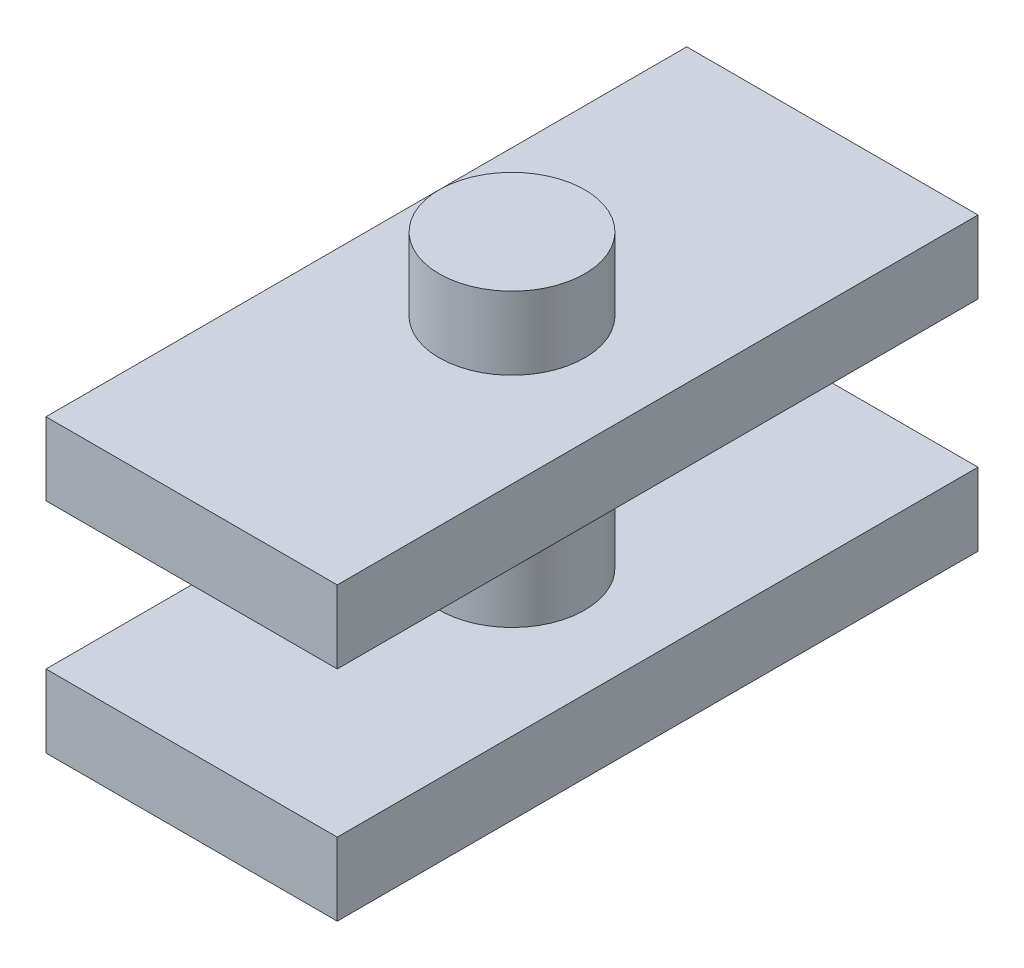
ISO-10303-21;
HEADER;
FILE_DESCRIPTION(('STEP AP214'),'2;1');
FILE_NAME('part.step','',(''),(''),'','','');
FILE_SCHEMA(('AUTOMOTIVE_DESIGN { 1 0 10303 214 1 1 1 1 }'));
ENDSEC;
DATA;
#1=APPLICATION_CONTEXT('core data for automotive mechanical design processes');
#2=APPLICATION_PROTOCOL_DEFINITION('international standard','automotive_design',2000,#1);
#3=PRODUCT_CONTEXT('',#1,'mechanical');
#4=PRODUCT('Part','Part','',(#3));
#5=PRODUCT_RELATED_PRODUCT_CATEGORY('part','',(#4));
#6=PRODUCT_DEFINITION_FORMATION('','',#4);
#7=PRODUCT_DEFINITION_CONTEXT('part definition',#1,'design');
#8=PRODUCT_DEFINITION('design','',#6,#7);
#9=PRODUCT_DEFINITION_SHAPE('','',#8);
#10=(LENGTH_UNIT() NAMED_UNIT(*) SI_UNIT(.MILLI.,.METRE.));
#11=(NAMED_UNIT(*) PLANE_ANGLE_UNIT() SI_UNIT($,.RADIAN.));
#12=(NAMED_UNIT(*) SI_UNIT($,.STERADIAN.) SOLID_ANGLE_UNIT());
#13=UNCERTAINTY_MEASURE_WITH_UNIT(LENGTH_MEASURE(1.E-05),#10,'distance_accuracy_value','');
#14=(GEOMETRIC_REPRESENTATION_CONTEXT(3) GLOBAL_UNCERTAINTY_ASSIGNED_CONTEXT((#13)) GLOBAL_UNIT_ASSIGNED_CONTEXT((#10,
#11,#12)) REPRESENTATION_CONTEXT('',''));
#15=CARTESIAN_POINT('',(0.,0.,0.));
#16=DIRECTION('',(0.,0.,1.));
#17=DIRECTION('',(1.,0.,0.));
#18=AXIS2_PLACEMENT_3D('',#15,#16,#17);
#19=CARTESIAN_POINT('',(-10.,9.99999999999999,-22.));
#20=DIRECTION('',(1.,0.,0.));
#21=DIRECTION('',(0.,0.,-1.));
#22=AXIS2_PLACEMENT_3D('',#19,#20,#21);
#23=PLANE('',#22);
#24=DIRECTION('',(0.,0.,1.));
#25=VECTOR('',#24,1.);
#26=CARTESIAN_POINT('',(-10.,4.99999999999999,-22.));
#27=LINE('',#26,#25);
#28=CARTESIAN_POINT('',(-10.,4.99999999999999,-22.));
#29=VERTEX_POINT('',#28);
#30=CARTESIAN_POINT('',(-10.,4.99999999999999,22.));
#31=VERTEX_POINT('',#30);
#32=EDGE_CURVE('E55',#29,#31,#27,.T.);
#33=ORIENTED_EDGE('',*,*,#32,.T.);
#34=DIRECTION('',(0.,-1.,0.));
#35=VECTOR('',#34,1.);
#36=CARTESIAN_POINT('',(-10.,9.99999999999999,22.));
#37=LINE('',#36,#35);
#38=CARTESIAN_POINT('',(-10.,9.99999999999999,22.));
#39=VERTEX_POINT('',#38);
#40=EDGE_CURVE('E133',#39,#31,#37,.T.);
#41=ORIENTED_EDGE('',*,*,#40,.F.);
#42=DIRECTION('',(0.,0.,1.));
#43=VECTOR('',#42,1.);
#44=CARTESIAN_POINT('',(-10.,9.99999999999999,-22.));
#45=LINE('',#44,#43);
#46=CARTESIAN_POINT('',(-10.,9.99999999999999,-22.));
#47=VERTEX_POINT('',#46);
#48=EDGE_CURVE('E208',#47,#39,#45,.T.);
#49=ORIENTED_EDGE('',*,*,#48,.F.);
#50=DIRECTION('',(0.,-1.,0.));
#51=VECTOR('',#50,1.);
#52=CARTESIAN_POINT('',(-10.,9.99999999999999,-22.));
#53=LINE('',#52,#51);
#54=EDGE_CURVE('E129',#47,#29,#53,.T.);
#55=ORIENTED_EDGE('',*,*,#54,.T.);
#56=EDGE_LOOP('',(#33,#41,#49,#55));
#57=FACE_BOUND('',#56,.T.);
#58=ADVANCED_FACE('F39',(#57),#23,.F.);
#59=CARTESIAN_POINT('',(-10.,9.99999999999999,22.));
#60=DIRECTION('',(0.,0.,-1.));
#61=DIRECTION('',(-1.,0.,0.));
#62=AXIS2_PLACEMENT_3D('',#59,#60,#61);
#63=PLANE('',#62);
#64=DIRECTION('',(1.,0.,0.));
#65=VECTOR('',#64,1.);
#66=CARTESIAN_POINT('',(-10.,4.99999999999999,22.));
#67=LINE('',#66,#65);
#68=CARTESIAN_POINT('',(10.,4.99999999999999,22.));
#69=VERTEX_POINT('',#68);
#70=EDGE_CURVE('E124',#31,#69,#67,.T.);
#71=ORIENTED_EDGE('',*,*,#70,.T.);
#72=DIRECTION('',(0.,-1.,0.));
#73=VECTOR('',#72,1.);
#74=CARTESIAN_POINT('',(10.,9.99999999999999,22.));
#75=LINE('',#74,#73);
#76=CARTESIAN_POINT('',(10.,9.99999999999999,22.));
#77=VERTEX_POINT('',#76);
#78=EDGE_CURVE('E122',#77,#69,#75,.T.);
#79=ORIENTED_EDGE('',*,*,#78,.F.);
#80=DIRECTION('',(1.,0.,0.));
#81=VECTOR('',#80,1.);
#82=CARTESIAN_POINT('',(-10.,9.99999999999999,22.));
#83=LINE('',#82,#81);
#84=EDGE_CURVE('E135',#39,#77,#83,.T.);
#85=ORIENTED_EDGE('',*,*,#84,.F.);
#86=ORIENTED_EDGE('',*,*,#40,.T.);
#87=EDGE_LOOP('',(#71,#79,#85,#86));
#88=FACE_BOUND('',#87,.T.);
#89=ADVANCED_FACE('F249',(#88),#63,.F.);
#90=CARTESIAN_POINT('',(10.,9.99999999999999,-22.));
#91=DIRECTION('',(-1.,0.,0.));
#92=DIRECTION('',(0.,0.,1.));
#93=AXIS2_PLACEMENT_3D('',#90,#91,#92);
#94=PLANE('',#93);
#95=DIRECTION('',(0.,0.,-1.));
#96=VECTOR('',#95,1.);
#97=CARTESIAN_POINT('',(10.,4.99999999999999,-22.));
#98=LINE('',#97,#96);
#99=CARTESIAN_POINT('',(10.,4.99999999999999,-22.));
#100=VERTEX_POINT('',#99);
#101=EDGE_CURVE('E106',#69,#100,#98,.T.);
#102=ORIENTED_EDGE('',*,*,#101,.T.);
#103=DIRECTION('',(0.,-1.,0.));
#104=VECTOR('',#103,1.);
#105=CARTESIAN_POINT('',(10.,9.99999999999999,-22.));
#106=LINE('',#105,#104);
#107=CARTESIAN_POINT('',(10.,9.99999999999999,-22.));
#108=VERTEX_POINT('',#107);
#109=EDGE_CURVE('E119',#108,#100,#106,.T.);
#110=ORIENTED_EDGE('',*,*,#109,.F.);
#111=DIRECTION('',(0.,0.,-1.));
#112=VECTOR('',#111,1.);
#113=CARTESIAN_POINT('',(10.,9.99999999999999,-22.));
#114=LINE('',#113,#112);
#115=EDGE_CURVE('E219',#77,#108,#114,.T.);
#116=ORIENTED_EDGE('',*,*,#115,.F.);
#117=ORIENTED_EDGE('',*,*,#78,.T.);
#118=EDGE_LOOP('',(#102,#110,#116,#117));
#119=FACE_BOUND('',#118,.T.);
#120=ADVANCED_FACE('F117',(#119),#94,.F.);
#121=CARTESIAN_POINT('',(-10.,9.99999999999999,-22.));
#122=DIRECTION('',(0.,0.,1.));
#123=DIRECTION('',(1.,0.,0.));
#124=AXIS2_PLACEMENT_3D('',#121,#122,#123);
#125=PLANE('',#124);
#126=DIRECTION('',(-1.,0.,0.));
#127=VECTOR('',#126,1.);
#128=CARTESIAN_POINT('',(-10.,4.99999999999999,-22.));
#129=LINE('',#128,#127);
#130=EDGE_CURVE('E102',#100,#29,#129,.T.);
#131=ORIENTED_EDGE('',*,*,#130,.T.);
#132=ORIENTED_EDGE('',*,*,#54,.F.);
#133=DIRECTION('',(-1.,0.,0.));
#134=VECTOR('',#133,1.);
#135=CARTESIAN_POINT('',(-10.,9.99999999999999,-22.));
#136=LINE('',#135,#134);
#137=EDGE_CURVE('E127',#108,#47,#136,.T.);
#138=ORIENTED_EDGE('',*,*,#137,.F.);
#139=ORIENTED_EDGE('',*,*,#109,.T.);
#140=EDGE_LOOP('',(#131,#132,#138,#139));
#141=FACE_BOUND('',#140,.T.);
#142=ADVANCED_FACE('F126',(#141),#125,.F.);
#143=CARTESIAN_POINT('',(0.,30.,0.));
#144=DIRECTION('',(0.,-1.,0.));
#145=DIRECTION('',(0.,0.,-1.));
#146=AXIS2_PLACEMENT_3D('',#143,#144,#145);
#147=CYLINDRICAL_SURFACE('',#146,5.);
#148=CARTESIAN_POINT('',(0.,20.,0.));
#149=DIRECTION('',(0.,1.,0.));
#150=DIRECTION('',(0.,0.,1.));
#151=AXIS2_PLACEMENT_3D('',#148,#149,#150);
#152=CIRCLE('',#151,5.);
#153=CARTESIAN_POINT('',(0.,20.,5.));
#154=VERTEX_POINT('',#153);
#155=EDGE_CURVE('E48',#154,#154,#152,.T.);
#156=ORIENTED_EDGE('',*,*,#155,.F.);
#157=EDGE_LOOP('',(#156));
#158=FACE_BOUND('',#157,.T.);
#159=CARTESIAN_POINT('',(0.,9.99999999999999,0.));
#160=DIRECTION('',(0.,-1.,0.));
#161=DIRECTION('',(0.,0.,-1.));
#162=AXIS2_PLACEMENT_3D('',#159,#160,#161);
#163=CIRCLE('',#162,5.);
#164=CARTESIAN_POINT('',(0.,9.99999999999999,-5.));
#165=VERTEX_POINT('',#164);
#166=EDGE_CURVE('E11',#165,#165,#163,.T.);
#167=ORIENTED_EDGE('',*,*,#166,.F.);
#168=EDGE_LOOP('',(#167));
#169=FACE_BOUND('',#168,.T.);
#170=ADVANCED_FACE('F41',(#158,#169),#147,.T.);
#171=CARTESIAN_POINT('',(-10.,20.,-22.));
#172=DIRECTION('',(-1.,0.,0.));
#173=DIRECTION('',(0.,0.,1.));
#174=AXIS2_PLACEMENT_3D('',#171,#172,#173);
#175=PLANE('',#174);
#176=DIRECTION('',(0.,1.,0.));
#177=VECTOR('',#176,1.);
#178=CARTESIAN_POINT('',(-10.,20.,22.));
#179=LINE('',#178,#177);
#180=CARTESIAN_POINT('',(-10.,20.,22.));
#181=VERTEX_POINT('',#180);
#182=CARTESIAN_POINT('',(-10.,25.,22.));
#183=VERTEX_POINT('',#182);
#184=EDGE_CURVE('E174',#181,#183,#179,.T.);
#185=ORIENTED_EDGE('',*,*,#184,.T.);
#186=DIRECTION('',(0.,0.,1.));
#187=VECTOR('',#186,1.);
#188=CARTESIAN_POINT('',(-10.,25.,-22.));
#189=LINE('',#188,#187);
#190=CARTESIAN_POINT('',(-10.,25.,-22.));
#191=VERTEX_POINT('',#190);
#192=EDGE_CURVE('E63',#191,#183,#189,.T.);
#193=ORIENTED_EDGE('',*,*,#192,.F.);
#194=DIRECTION('',(0.,1.,0.));
#195=VECTOR('',#194,1.);
#196=CARTESIAN_POINT('',(-10.,20.,-22.));
#197=LINE('',#196,#195);
#198=CARTESIAN_POINT('',(-10.,20.,-22.));
#199=VERTEX_POINT('',#198);
#200=EDGE_CURVE('E175',#199,#191,#197,.T.);
#201=ORIENTED_EDGE('',*,*,#200,.F.);
#202=DIRECTION('',(0.,0.,1.));
#203=VECTOR('',#202,1.);
#204=CARTESIAN_POINT('',(-10.,20.,-22.));
#205=LINE('',#204,#203);
#206=EDGE_CURVE('E158',#199,#181,#205,.T.);
#207=ORIENTED_EDGE('',*,*,#206,.T.);
#208=EDGE_LOOP('',(#185,#193,#201,#207));
#209=FACE_BOUND('',#208,.T.);
#210=ADVANCED_FACE('F198',(#209),#175,.T.);
#211=CARTESIAN_POINT('',(-10.,20.,-22.));
#212=DIRECTION('',(0.,0.,-1.));
#213=DIRECTION('',(-1.,0.,0.));
#214=AXIS2_PLACEMENT_3D('',#211,#212,#213);
#215=PLANE('',#214);
#216=ORIENTED_EDGE('',*,*,#200,.T.);
#217=DIRECTION('',(-1.,0.,0.));
#218=VECTOR('',#217,1.);
#219=CARTESIAN_POINT('',(-10.,25.,-22.));
#220=LINE('',#219,#218);
#221=CARTESIAN_POINT('',(10.,25.,-22.));
#222=VERTEX_POINT('',#221);
#223=EDGE_CURVE('E155',#222,#191,#220,.T.);
#224=ORIENTED_EDGE('',*,*,#223,.F.);
#225=DIRECTION('',(0.,1.,0.));
#226=VECTOR('',#225,1.);
#227=CARTESIAN_POINT('',(10.,20.,-22.));
#228=LINE('',#227,#226);
#229=CARTESIAN_POINT('',(10.,20.,-22.));
#230=VERTEX_POINT('',#229);
#231=EDGE_CURVE('E179',#230,#222,#228,.T.);
#232=ORIENTED_EDGE('',*,*,#231,.F.);
#233=DIRECTION('',(-1.,0.,0.));
#234=VECTOR('',#233,1.);
#235=CARTESIAN_POINT('',(-10.,20.,-22.));
#236=LINE('',#235,#234);
#237=EDGE_CURVE('E170',#230,#199,#236,.T.);
#238=ORIENTED_EDGE('',*,*,#237,.T.);
#239=EDGE_LOOP('',(#216,#224,#232,#238));
#240=FACE_BOUND('',#239,.T.);
#241=ADVANCED_FACE('F269',(#240),#215,.T.);
#242=CARTESIAN_POINT('',(10.,20.,-22.));
#243=DIRECTION('',(1.,0.,0.));
#244=DIRECTION('',(0.,0.,-1.));
#245=AXIS2_PLACEMENT_3D('',#242,#243,#244);
#246=PLANE('',#245);
#247=ORIENTED_EDGE('',*,*,#231,.T.);
#248=DIRECTION('',(0.,0.,-1.));
#249=VECTOR('',#248,1.);
#250=CARTESIAN_POINT('',(10.,25.,-22.));
#251=LINE('',#250,#249);
#252=CARTESIAN_POINT('',(10.,25.,22.));
#253=VERTEX_POINT('',#252);
#254=EDGE_CURVE('E152',#253,#222,#251,.T.);
#255=ORIENTED_EDGE('',*,*,#254,.F.);
#256=DIRECTION('',(0.,1.,0.));
#257=VECTOR('',#256,1.);
#258=CARTESIAN_POINT('',(10.,20.,22.));
#259=LINE('',#258,#257);
#260=CARTESIAN_POINT('',(10.,20.,22.));
#261=VERTEX_POINT('',#260);
#262=EDGE_CURVE('E183',#261,#253,#259,.T.);
#263=ORIENTED_EDGE('',*,*,#262,.F.);
#264=DIRECTION('',(0.,0.,-1.));
#265=VECTOR('',#264,1.);
#266=CARTESIAN_POINT('',(10.,20.,-22.));
#267=LINE('',#266,#265);
#268=EDGE_CURVE('E166',#261,#230,#267,.T.);
#269=ORIENTED_EDGE('',*,*,#268,.T.);
#270=EDGE_LOOP('',(#247,#255,#263,#269));
#271=FACE_BOUND('',#270,.T.);
#272=ADVANCED_FACE('F272',(#271),#246,.T.);
#273=CARTESIAN_POINT('',(-10.,20.,22.));
#274=DIRECTION('',(0.,0.,1.));
#275=DIRECTION('',(1.,0.,0.));
#276=AXIS2_PLACEMENT_3D('',#273,#274,#275);
#277=PLANE('',#276);
#278=ORIENTED_EDGE('',*,*,#262,.T.);
#279=DIRECTION('',(1.,0.,0.));
#280=VECTOR('',#279,1.);
#281=CARTESIAN_POINT('',(-10.,25.,22.));
#282=LINE('',#281,#280);
#283=EDGE_CURVE('E149',#183,#253,#282,.T.);
#284=ORIENTED_EDGE('',*,*,#283,.F.);
#285=ORIENTED_EDGE('',*,*,#184,.F.);
#286=DIRECTION('',(1.,0.,0.));
#287=VECTOR('',#286,1.);
#288=CARTESIAN_POINT('',(-10.,20.,22.));
#289=LINE('',#288,#287);
#290=EDGE_CURVE('E162',#181,#261,#289,.T.);
#291=ORIENTED_EDGE('',*,*,#290,.T.);
#292=EDGE_LOOP('',(#278,#284,#285,#291));
#293=FACE_BOUND('',#292,.T.);
#294=ADVANCED_FACE('F268',(#293),#277,.T.);
#295=CARTESIAN_POINT('',(0.,20.,0.));
#296=DIRECTION('',(0.,1.,0.));
#297=DIRECTION('',(0.,0.,1.));
#298=AXIS2_PLACEMENT_3D('',#295,#296,#297);
#299=PLANE('',#298);
#300=ORIENTED_EDGE('',*,*,#155,.T.);
#301=EDGE_LOOP('',(#300));
#302=FACE_BOUND('',#301,.T.);
#303=ORIENTED_EDGE('',*,*,#206,.F.);
#304=ORIENTED_EDGE('',*,*,#237,.F.);
#305=ORIENTED_EDGE('',*,*,#268,.F.);
#306=ORIENTED_EDGE('',*,*,#290,.F.);
#307=EDGE_LOOP('',(#303,#304,#305,#306));
#308=FACE_BOUND('',#307,.T.);
#309=ADVANCED_FACE('F193',(#302,#308),#299,.F.);
#310=CARTESIAN_POINT('',(0.,25.,0.));
#311=DIRECTION('',(0.,1.,0.));
#312=DIRECTION('',(0.,0.,1.));
#313=AXIS2_PLACEMENT_3D('',#310,#311,#312);
#314=PLANE('',#313);
#315=CARTESIAN_POINT('',(0.,25.,0.));
#316=DIRECTION('',(0.,1.,0.));
#317=DIRECTION('',(0.,0.,1.));
#318=AXIS2_PLACEMENT_3D('',#315,#316,#317);
#319=CIRCLE('',#318,5.);
#320=CARTESIAN_POINT('',(0.,25.,5.));
#321=VERTEX_POINT('',#320);
#322=EDGE_CURVE('E139',#321,#321,#319,.T.);
#323=ORIENTED_EDGE('',*,*,#322,.F.);
#324=EDGE_LOOP('',(#323));
#325=FACE_BOUND('',#324,.T.);
#326=ORIENTED_EDGE('',*,*,#192,.T.);
#327=ORIENTED_EDGE('',*,*,#283,.T.);
#328=ORIENTED_EDGE('',*,*,#254,.T.);
#329=ORIENTED_EDGE('',*,*,#223,.T.);
#330=EDGE_LOOP('',(#326,#327,#328,#329));
#331=FACE_BOUND('',#330,.T.);
#332=ADVANCED_FACE('F261',(#325,#331),#314,.T.);
#333=CARTESIAN_POINT('',(0.,25.,0.));
#334=DIRECTION('',(0.,1.,0.));
#335=DIRECTION('',(0.,0.,1.));
#336=AXIS2_PLACEMENT_3D('',#333,#334,#335);
#337=CYLINDRICAL_SURFACE('',#336,5.);
#338=ORIENTED_EDGE('',*,*,#322,.T.);
#339=EDGE_LOOP('',(#338));
#340=FACE_BOUND('',#339,.T.);
#341=CARTESIAN_POINT('',(0.,30.,0.));
#342=DIRECTION('',(0.,1.,0.));
#343=DIRECTION('',(0.,0.,1.));
#344=AXIS2_PLACEMENT_3D('',#341,#342,#343);
#345=CIRCLE('',#344,5.);
#346=CARTESIAN_POINT('',(0.,30.,5.));
#347=VERTEX_POINT('',#346);
#348=EDGE_CURVE('E143',#347,#347,#345,.T.);
#349=ORIENTED_EDGE('',*,*,#348,.F.);
#350=EDGE_LOOP('',(#349));
#351=FACE_BOUND('',#350,.T.);
#352=ADVANCED_FACE('F258',(#340,#351),#337,.T.);
#353=CARTESIAN_POINT('',(0.,30.,0.));
#354=DIRECTION('',(0.,1.,0.));
#355=DIRECTION('',(0.,0.,1.));
#356=AXIS2_PLACEMENT_3D('',#353,#354,#355);
#357=PLANE('',#356);
#358=ORIENTED_EDGE('',*,*,#348,.T.);
#359=EDGE_LOOP('',(#358));
#360=FACE_BOUND('',#359,.T.);
#361=ADVANCED_FACE('F204',(#360),#357,.T.);
#362=CARTESIAN_POINT('',(0.,9.99999999999999,0.));
#363=DIRECTION('',(0.,-1.,0.));
#364=DIRECTION('',(0.,0.,1.));
#365=AXIS2_PLACEMENT_3D('',#362,#363,#364);
#366=PLANE('',#365);
#367=ORIENTED_EDGE('',*,*,#166,.T.);
#368=EDGE_LOOP('',(#367));
#369=FACE_BOUND('',#368,.T.);
#370=ORIENTED_EDGE('',*,*,#48,.T.);
#371=ORIENTED_EDGE('',*,*,#84,.T.);
#372=ORIENTED_EDGE('',*,*,#115,.T.);
#373=ORIENTED_EDGE('',*,*,#137,.T.);
#374=EDGE_LOOP('',(#370,#371,#372,#373));
#375=FACE_BOUND('',#374,.T.);
#376=ADVANCED_FACE('F201',(#369,#375),#366,.F.);
#377=CARTESIAN_POINT('',(0.,4.99999999999999,0.));
#378=DIRECTION('',(0.,-1.,0.));
#379=DIRECTION('',(0.,0.,1.));
#380=AXIS2_PLACEMENT_3D('',#377,#378,#379);
#381=PLANE('',#380);
#382=ORIENTED_EDGE('',*,*,#32,.F.);
#383=ORIENTED_EDGE('',*,*,#130,.F.);
#384=ORIENTED_EDGE('',*,*,#101,.F.);
#385=ORIENTED_EDGE('',*,*,#70,.F.);
#386=EDGE_LOOP('',(#382,#383,#384,#385));
#387=FACE_BOUND('',#386,.T.);
#388=CARTESIAN_POINT('',(0.,4.99999999999999,0.));
#389=DIRECTION('',(0.,1.,0.));
#390=DIRECTION('',(0.,0.,1.));
#391=AXIS2_PLACEMENT_3D('',#388,#389,#390);
#392=CIRCLE('',#391,5.);
#393=CARTESIAN_POINT('',(0.,4.99999999999999,5.));
#394=VERTEX_POINT('',#393);
#395=EDGE_CURVE('E228',#394,#394,#392,.T.);
#396=ORIENTED_EDGE('',*,*,#395,.T.);
#397=EDGE_LOOP('',(#396));
#398=FACE_BOUND('',#397,.T.);
#399=ADVANCED_FACE('F104',(#387,#398),#381,.T.);
#400=CARTESIAN_POINT('',(0.,4.99999999999999,0.));
#401=DIRECTION('',(0.,-1.,0.));
#402=DIRECTION('',(0.,0.,-1.));
#403=AXIS2_PLACEMENT_3D('',#400,#401,#402);
#404=CYLINDRICAL_SURFACE('',#403,5.);
#405=ORIENTED_EDGE('',*,*,#395,.F.);
#406=EDGE_LOOP('',(#405));
#407=FACE_BOUND('',#406,.T.);
#408=CARTESIAN_POINT('',(0.,0.,0.));
#409=DIRECTION('',(0.,1.,0.));
#410=DIRECTION('',(0.,0.,1.));
#411=AXIS2_PLACEMENT_3D('',#408,#409,#410);
#412=CIRCLE('',#411,5.);
#413=CARTESIAN_POINT('',(0.,0.,5.));
#414=VERTEX_POINT('',#413);
#415=EDGE_CURVE('E229',#414,#414,#412,.T.);
#416=ORIENTED_EDGE('',*,*,#415,.T.);
#417=EDGE_LOOP('',(#416));
#418=FACE_BOUND('',#417,.T.);
#419=ADVANCED_FACE('F237',(#407,#418),#404,.T.);
#420=CARTESIAN_POINT('',(0.,0.,0.));
#421=DIRECTION('',(0.,1.,0.));
#422=DIRECTION('',(0.,0.,1.));
#423=AXIS2_PLACEMENT_3D('',#420,#421,#422);
#424=PLANE('',#423);
#425=ORIENTED_EDGE('',*,*,#415,.F.);
#426=EDGE_LOOP('',(#425));
#427=FACE_BOUND('',#426,.T.);
#428=ADVANCED_FACE('F240',(#427),#424,.F.);
#429=CLOSED_SHELL('',(#58,#89,#120,#142,#170,#210,#241,#272,#294,#309,#332,#352,#361,#376,#399,
#419,#428));
#430=MANIFOLD_SOLID_BREP('B2',#429);
#431=ADVANCED_BREP_SHAPE_REPRESENTATION('',(#18,#430),#14);
#432=SHAPE_DEFINITION_REPRESENTATION(#9,#431);
ENDSEC;
END-ISO-10303-21;
